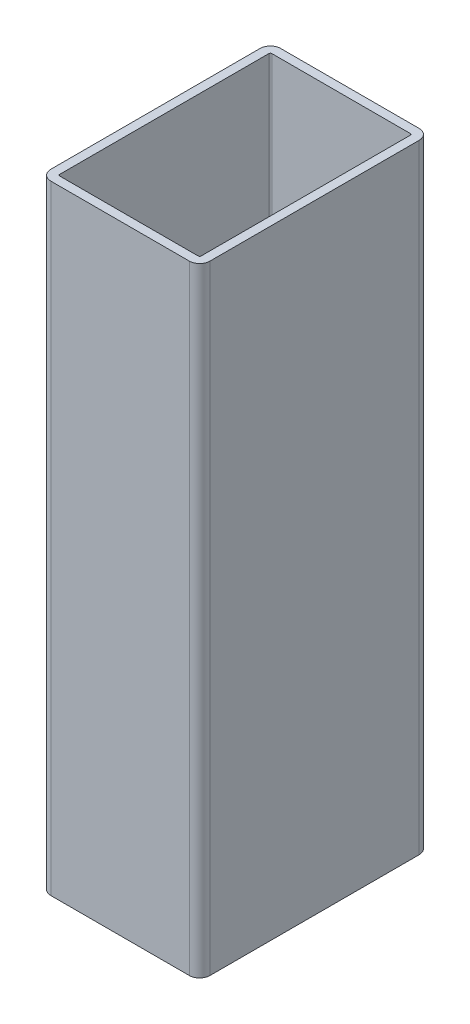
ISO-10303-21;
HEADER;
FILE_DESCRIPTION(('STEP AP214'),'2;1');
FILE_NAME('part.step','',(''),(''),'','','');
FILE_SCHEMA(('AUTOMOTIVE_DESIGN { 1 0 10303 214 1 1 1 1 }'));
ENDSEC;
DATA;
#1=APPLICATION_CONTEXT('core data for automotive mechanical design processes');
#2=APPLICATION_PROTOCOL_DEFINITION('international standard','automotive_design',2000,#1);
#3=PRODUCT_CONTEXT('',#1,'mechanical');
#4=PRODUCT('Part','Part','',(#3));
#5=PRODUCT_RELATED_PRODUCT_CATEGORY('part','',(#4));
#6=PRODUCT_DEFINITION_FORMATION('','',#4);
#7=PRODUCT_DEFINITION_CONTEXT('part definition',#1,'design');
#8=PRODUCT_DEFINITION('design','',#6,#7);
#9=PRODUCT_DEFINITION_SHAPE('','',#8);
#10=(LENGTH_UNIT() NAMED_UNIT(*) SI_UNIT(.MILLI.,.METRE.));
#11=(NAMED_UNIT(*) PLANE_ANGLE_UNIT() SI_UNIT($,.RADIAN.));
#12=(NAMED_UNIT(*) SI_UNIT($,.STERADIAN.) SOLID_ANGLE_UNIT());
#13=UNCERTAINTY_MEASURE_WITH_UNIT(LENGTH_MEASURE(1.E-05),#10,'distance_accuracy_value','');
#14=(GEOMETRIC_REPRESENTATION_CONTEXT(3) GLOBAL_UNCERTAINTY_ASSIGNED_CONTEXT((#13)) GLOBAL_UNIT_ASSIGNED_CONTEXT((#10,
#11,#12)) REPRESENTATION_CONTEXT('',''));
#15=CARTESIAN_POINT('',(0.,0.,0.));
#16=DIRECTION('',(0.,0.,1.));
#17=DIRECTION('',(1.,0.,0.));
#18=AXIS2_PLACEMENT_3D('',#15,#16,#17);
#19=CARTESIAN_POINT('',(-78.3333333333334,700.,118.333333333333));
#20=DIRECTION('',(0.,-1.,0.));
#21=DIRECTION('',(0.,0.,-1.));
#22=AXIS2_PLACEMENT_3D('',#19,#20,#21);
#23=CYLINDRICAL_SURFACE('',#22,11.6666666666667);
#24=CARTESIAN_POINT('',(-78.3333333333334,0.,118.333333333333));
#25=DIRECTION('',(0.,1.,0.));
#26=DIRECTION('',(0.,0.,1.));
#27=AXIS2_PLACEMENT_3D('',#24,#25,#26);
#28=CIRCLE('',#27,11.6666666666667);
#29=CARTESIAN_POINT('',(-90.0000000000001,0.,118.333333333333));
#30=VERTEX_POINT('',#29);
#31=CARTESIAN_POINT('',(-78.3333333333334,0.,130.));
#32=VERTEX_POINT('',#31);
#33=EDGE_CURVE('E236',#30,#32,#28,.T.);
#34=ORIENTED_EDGE('',*,*,#33,.T.);
#35=DIRECTION('',(0.,-1.,0.));
#36=VECTOR('',#35,1.);
#37=CARTESIAN_POINT('',(-78.3333333333334,700.,130.));
#38=LINE('',#37,#36);
#39=CARTESIAN_POINT('',(-78.3333333333334,700.,130.));
#40=VERTEX_POINT('',#39);
#41=EDGE_CURVE('E12',#40,#32,#38,.T.);
#42=ORIENTED_EDGE('',*,*,#41,.F.);
#43=CARTESIAN_POINT('',(-78.3333333333334,700.,118.333333333333));
#44=DIRECTION('',(0.,1.,0.));
#45=DIRECTION('',(0.,0.,1.));
#46=AXIS2_PLACEMENT_3D('',#43,#44,#45);
#47=CIRCLE('',#46,11.6666666666667);
#48=CARTESIAN_POINT('',(-90.0000000000001,700.,118.333333333333));
#49=VERTEX_POINT('',#48);
#50=EDGE_CURVE('E314',#49,#40,#47,.T.);
#51=ORIENTED_EDGE('',*,*,#50,.F.);
#52=DIRECTION('',(0.,-1.,0.));
#53=VECTOR('',#52,1.);
#54=CARTESIAN_POINT('',(-90.0000000000001,700.,118.333333333333));
#55=LINE('',#54,#53);
#56=EDGE_CURVE('E251',#49,#30,#55,.T.);
#57=ORIENTED_EDGE('',*,*,#56,.T.);
#58=EDGE_LOOP('',(#34,#42,#51,#57));
#59=FACE_BOUND('',#58,.T.);
#60=ADVANCED_FACE('F64',(#59),#23,.T.);
#61=CARTESIAN_POINT('',(-78.3333333333334,700.,130.));
#62=DIRECTION('',(0.,0.,-1.));
#63=DIRECTION('',(-1.,0.,0.));
#64=AXIS2_PLACEMENT_3D('',#61,#62,#63);
#65=PLANE('',#64);
#66=DIRECTION('',(1.,0.,0.));
#67=VECTOR('',#66,1.);
#68=CARTESIAN_POINT('',(-78.3333333333334,0.,130.));
#69=LINE('',#68,#67);
#70=CARTESIAN_POINT('',(78.3333333333334,0.,130.));
#71=VERTEX_POINT('',#70);
#72=EDGE_CURVE('E239',#32,#71,#69,.T.);
#73=ORIENTED_EDGE('',*,*,#72,.T.);
#74=DIRECTION('',(0.,-1.,0.));
#75=VECTOR('',#74,1.);
#76=CARTESIAN_POINT('',(78.3333333333334,700.,130.));
#77=LINE('',#76,#75);
#78=CARTESIAN_POINT('',(78.3333333333334,700.,130.));
#79=VERTEX_POINT('',#78);
#80=EDGE_CURVE('E74',#79,#71,#77,.T.);
#81=ORIENTED_EDGE('',*,*,#80,.F.);
#82=DIRECTION('',(1.,0.,0.));
#83=VECTOR('',#82,1.);
#84=CARTESIAN_POINT('',(-78.3333333333334,700.,130.));
#85=LINE('',#84,#83);
#86=EDGE_CURVE('E316',#40,#79,#85,.T.);
#87=ORIENTED_EDGE('',*,*,#86,.F.);
#88=ORIENTED_EDGE('',*,*,#41,.T.);
#89=EDGE_LOOP('',(#73,#81,#87,#88));
#90=FACE_BOUND('',#89,.T.);
#91=ADVANCED_FACE('F351',(#90),#65,.F.);
#92=CARTESIAN_POINT('',(78.3333333333334,700.,118.333333333333));
#93=DIRECTION('',(0.,-1.,0.));
#94=DIRECTION('',(0.,0.,-1.));
#95=AXIS2_PLACEMENT_3D('',#92,#93,#94);
#96=CYLINDRICAL_SURFACE('',#95,11.6666666666667);
#97=CARTESIAN_POINT('',(78.3333333333334,0.,118.333333333333));
#98=DIRECTION('',(0.,1.,0.));
#99=DIRECTION('',(0.,0.,1.));
#100=AXIS2_PLACEMENT_3D('',#97,#98,#99);
#101=CIRCLE('',#100,11.6666666666667);
#102=CARTESIAN_POINT('',(90.0000000000001,0.,118.333333333333));
#103=VERTEX_POINT('',#102);
#104=EDGE_CURVE('E241',#71,#103,#101,.T.);
#105=ORIENTED_EDGE('',*,*,#104,.T.);
#106=DIRECTION('',(0.,-1.,0.));
#107=VECTOR('',#106,1.);
#108=CARTESIAN_POINT('',(90.0000000000001,700.,118.333333333333));
#109=LINE('',#108,#107);
#110=CARTESIAN_POINT('',(90.0000000000001,700.,118.333333333333));
#111=VERTEX_POINT('',#110);
#112=EDGE_CURVE('E258',#111,#103,#109,.T.);
#113=ORIENTED_EDGE('',*,*,#112,.F.);
#114=CARTESIAN_POINT('',(78.3333333333334,700.,118.333333333333));
#115=DIRECTION('',(0.,1.,0.));
#116=DIRECTION('',(0.,0.,1.));
#117=AXIS2_PLACEMENT_3D('',#114,#115,#116);
#118=CIRCLE('',#117,11.6666666666667);
#119=EDGE_CURVE('E318',#79,#111,#118,.T.);
#120=ORIENTED_EDGE('',*,*,#119,.F.);
#121=ORIENTED_EDGE('',*,*,#80,.T.);
#122=EDGE_LOOP('',(#105,#113,#120,#121));
#123=FACE_BOUND('',#122,.T.);
#124=ADVANCED_FACE('F356',(#123),#96,.T.);
#125=CARTESIAN_POINT('',(90.,700.,-118.333333333333));
#126=DIRECTION('',(-1.,0.,0.));
#127=DIRECTION('',(0.,0.,1.));
#128=AXIS2_PLACEMENT_3D('',#125,#126,#127);
#129=PLANE('',#128);
#130=DIRECTION('',(0.,0.,-1.));
#131=VECTOR('',#130,1.);
#132=CARTESIAN_POINT('',(90.,0.,-118.333333333333));
#133=LINE('',#132,#131);
#134=CARTESIAN_POINT('',(90.0000000000001,0.,-118.333333333333));
#135=VERTEX_POINT('',#134);
#136=EDGE_CURVE('E243',#103,#135,#133,.T.);
#137=ORIENTED_EDGE('',*,*,#136,.T.);
#138=DIRECTION('',(0.,-1.,0.));
#139=VECTOR('',#138,1.);
#140=CARTESIAN_POINT('',(90.0000000000001,700.,-118.333333333333));
#141=LINE('',#140,#139);
#142=CARTESIAN_POINT('',(90.0000000000001,700.,-118.333333333333));
#143=VERTEX_POINT('',#142);
#144=EDGE_CURVE('E255',#143,#135,#141,.T.);
#145=ORIENTED_EDGE('',*,*,#144,.F.);
#146=DIRECTION('',(0.,0.,-1.));
#147=VECTOR('',#146,1.);
#148=CARTESIAN_POINT('',(90.,700.,-118.333333333333));
#149=LINE('',#148,#147);
#150=EDGE_CURVE('E320',#111,#143,#149,.T.);
#151=ORIENTED_EDGE('',*,*,#150,.F.);
#152=ORIENTED_EDGE('',*,*,#112,.T.);
#153=EDGE_LOOP('',(#137,#145,#151,#152));
#154=FACE_BOUND('',#153,.T.);
#155=ADVANCED_FACE('F326',(#154),#129,.F.);
#156=CARTESIAN_POINT('',(78.3333333333334,700.,-118.333333333333));
#157=DIRECTION('',(0.,-1.,0.));
#158=DIRECTION('',(0.,0.,-1.));
#159=AXIS2_PLACEMENT_3D('',#156,#157,#158);
#160=CYLINDRICAL_SURFACE('',#159,11.6666666666667);
#161=CARTESIAN_POINT('',(78.3333333333334,0.,-118.333333333333));
#162=DIRECTION('',(0.,1.,0.));
#163=DIRECTION('',(0.,0.,1.));
#164=AXIS2_PLACEMENT_3D('',#161,#162,#163);
#165=CIRCLE('',#164,11.6666666666667);
#166=CARTESIAN_POINT('',(78.3333333333334,0.,-130.));
#167=VERTEX_POINT('',#166);
#168=EDGE_CURVE('E245',#135,#167,#165,.T.);
#169=ORIENTED_EDGE('',*,*,#168,.T.);
#170=DIRECTION('',(0.,-1.,0.));
#171=VECTOR('',#170,1.);
#172=CARTESIAN_POINT('',(78.3333333333334,700.,-130.));
#173=LINE('',#172,#171);
#174=CARTESIAN_POINT('',(78.3333333333334,700.,-130.));
#175=VERTEX_POINT('',#174);
#176=EDGE_CURVE('E203',#175,#167,#173,.T.);
#177=ORIENTED_EDGE('',*,*,#176,.F.);
#178=CARTESIAN_POINT('',(78.3333333333334,700.,-118.333333333333));
#179=DIRECTION('',(0.,1.,0.));
#180=DIRECTION('',(0.,0.,1.));
#181=AXIS2_PLACEMENT_3D('',#178,#179,#180);
#182=CIRCLE('',#181,11.6666666666667);
#183=EDGE_CURVE('E194',#143,#175,#182,.T.);
#184=ORIENTED_EDGE('',*,*,#183,.F.);
#185=ORIENTED_EDGE('',*,*,#144,.T.);
#186=EDGE_LOOP('',(#169,#177,#184,#185));
#187=FACE_BOUND('',#186,.T.);
#188=ADVANCED_FACE('F330',(#187),#160,.T.);
#189=CARTESIAN_POINT('',(78.3333333333334,700.,-130.));
#190=DIRECTION('',(0.,0.,1.));
#191=DIRECTION('',(1.,0.,0.));
#192=AXIS2_PLACEMENT_3D('',#189,#190,#191);
#193=PLANE('',#192);
#194=DIRECTION('',(-1.,0.,0.));
#195=VECTOR('',#194,1.);
#196=CARTESIAN_POINT('',(78.3333333333334,0.,-130.));
#197=LINE('',#196,#195);
#198=CARTESIAN_POINT('',(-78.3333333333334,0.,-130.));
#199=VERTEX_POINT('',#198);
#200=EDGE_CURVE('E202',#167,#199,#197,.T.);
#201=ORIENTED_EDGE('',*,*,#200,.T.);
#202=DIRECTION('',(0.,-1.,0.));
#203=VECTOR('',#202,1.);
#204=CARTESIAN_POINT('',(-78.3333333333334,700.,-130.));
#205=LINE('',#204,#203);
#206=CARTESIAN_POINT('',(-78.3333333333334,700.,-130.));
#207=VERTEX_POINT('',#206);
#208=EDGE_CURVE('E199',#207,#199,#205,.T.);
#209=ORIENTED_EDGE('',*,*,#208,.F.);
#210=DIRECTION('',(-1.,0.,0.));
#211=VECTOR('',#210,1.);
#212=CARTESIAN_POINT('',(78.3333333333334,700.,-130.));
#213=LINE('',#212,#211);
#214=EDGE_CURVE('E188',#175,#207,#213,.T.);
#215=ORIENTED_EDGE('',*,*,#214,.F.);
#216=ORIENTED_EDGE('',*,*,#176,.T.);
#217=EDGE_LOOP('',(#201,#209,#215,#216));
#218=FACE_BOUND('',#217,.T.);
#219=ADVANCED_FACE('F200',(#218),#193,.F.);
#220=CARTESIAN_POINT('',(-78.3333333333334,700.,-118.333333333333));
#221=DIRECTION('',(0.,-1.,0.));
#222=DIRECTION('',(0.,0.,-1.));
#223=AXIS2_PLACEMENT_3D('',#220,#221,#222);
#224=CYLINDRICAL_SURFACE('',#223,11.6666666666667);
#225=CARTESIAN_POINT('',(-78.3333333333334,0.,-118.333333333333));
#226=DIRECTION('',(0.,1.,0.));
#227=DIRECTION('',(0.,0.,1.));
#228=AXIS2_PLACEMENT_3D('',#225,#226,#227);
#229=CIRCLE('',#228,11.6666666666667);
#230=CARTESIAN_POINT('',(-90.0000000000001,0.,-118.333333333333));
#231=VERTEX_POINT('',#230);
#232=EDGE_CURVE('E136',#199,#231,#229,.T.);
#233=ORIENTED_EDGE('',*,*,#232,.T.);
#234=DIRECTION('',(0.,-1.,0.));
#235=VECTOR('',#234,1.);
#236=CARTESIAN_POINT('',(-90.0000000000001,700.,-118.333333333333));
#237=LINE('',#236,#235);
#238=CARTESIAN_POINT('',(-90.0000000000001,700.,-118.333333333333));
#239=VERTEX_POINT('',#238);
#240=EDGE_CURVE('E204',#239,#231,#237,.T.);
#241=ORIENTED_EDGE('',*,*,#240,.F.);
#242=CARTESIAN_POINT('',(-78.3333333333334,700.,-118.333333333333));
#243=DIRECTION('',(0.,1.,0.));
#244=DIRECTION('',(0.,0.,1.));
#245=AXIS2_PLACEMENT_3D('',#242,#243,#244);
#246=CIRCLE('',#245,11.6666666666667);
#247=EDGE_CURVE('E192',#207,#239,#246,.T.);
#248=ORIENTED_EDGE('',*,*,#247,.F.);
#249=ORIENTED_EDGE('',*,*,#208,.T.);
#250=EDGE_LOOP('',(#233,#241,#248,#249));
#251=FACE_BOUND('',#250,.T.);
#252=ADVANCED_FACE('F206',(#251),#224,.T.);
#253=CARTESIAN_POINT('',(78.3333333333334,700.,118.333333333333));
#254=DIRECTION('',(0.,-1.,0.));
#255=DIRECTION('',(0.,0.,-1.));
#256=AXIS2_PLACEMENT_3D('',#253,#254,#255);
#257=CYLINDRICAL_SURFACE('',#256,1.66666666666669);
#258=CARTESIAN_POINT('',(78.3333333333334,0.,118.333333333333));
#259=DIRECTION('',(0.,1.,0.));
#260=DIRECTION('',(0.,0.,1.));
#261=AXIS2_PLACEMENT_3D('',#258,#259,#260);
#262=CIRCLE('',#261,1.66666666666669);
#263=CARTESIAN_POINT('',(78.3333333333334,0.,120.));
#264=VERTEX_POINT('',#263);
#265=CARTESIAN_POINT('',(80.0000000000001,0.,118.333333333333));
#266=VERTEX_POINT('',#265);
#267=EDGE_CURVE('E212',#264,#266,#262,.T.);
#268=ORIENTED_EDGE('',*,*,#267,.F.);
#269=DIRECTION('',(0.,-1.,0.));
#270=VECTOR('',#269,1.);
#271=CARTESIAN_POINT('',(78.3333333333334,700.,120.));
#272=LINE('',#271,#270);
#273=CARTESIAN_POINT('',(78.3333333333334,700.,120.));
#274=VERTEX_POINT('',#273);
#275=EDGE_CURVE('E68',#274,#264,#272,.T.);
#276=ORIENTED_EDGE('',*,*,#275,.F.);
#277=CARTESIAN_POINT('',(78.3333333333334,700.,118.333333333333));
#278=DIRECTION('',(0.,1.,0.));
#279=DIRECTION('',(0.,0.,1.));
#280=AXIS2_PLACEMENT_3D('',#277,#278,#279);
#281=CIRCLE('',#280,1.66666666666669);
#282=CARTESIAN_POINT('',(80.0000000000001,700.,118.333333333333));
#283=VERTEX_POINT('',#282);
#284=EDGE_CURVE('E250',#274,#283,#281,.T.);
#285=ORIENTED_EDGE('',*,*,#284,.T.);
#286=DIRECTION('',(0.,-1.,0.));
#287=VECTOR('',#286,1.);
#288=CARTESIAN_POINT('',(80.0000000000001,700.,118.333333333333));
#289=LINE('',#288,#287);
#290=EDGE_CURVE('E208',#283,#266,#289,.T.);
#291=ORIENTED_EDGE('',*,*,#290,.T.);
#292=EDGE_LOOP('',(#268,#276,#285,#291));
#293=FACE_BOUND('',#292,.T.);
#294=ADVANCED_FACE('F66',(#293),#257,.F.);
#295=CARTESIAN_POINT('',(-78.3333333333334,700.,120.));
#296=DIRECTION('',(0.,0.,-1.));
#297=DIRECTION('',(-1.,0.,0.));
#298=AXIS2_PLACEMENT_3D('',#295,#296,#297);
#299=PLANE('',#298);
#300=DIRECTION('',(1.,0.,0.));
#301=VECTOR('',#300,1.);
#302=CARTESIAN_POINT('',(-78.3333333333334,0.,120.));
#303=LINE('',#302,#301);
#304=CARTESIAN_POINT('',(-78.3333333333334,0.,120.));
#305=VERTEX_POINT('',#304);
#306=EDGE_CURVE('E215',#305,#264,#303,.T.);
#307=ORIENTED_EDGE('',*,*,#306,.F.);
#308=DIRECTION('',(0.,-1.,0.));
#309=VECTOR('',#308,1.);
#310=CARTESIAN_POINT('',(-78.3333333333334,700.,120.));
#311=LINE('',#310,#309);
#312=CARTESIAN_POINT('',(-78.3333333333334,700.,120.));
#313=VERTEX_POINT('',#312);
#314=EDGE_CURVE('E273',#313,#305,#311,.T.);
#315=ORIENTED_EDGE('',*,*,#314,.F.);
#316=DIRECTION('',(1.,0.,0.));
#317=VECTOR('',#316,1.);
#318=CARTESIAN_POINT('',(-78.3333333333334,700.,120.));
#319=LINE('',#318,#317);
#320=EDGE_CURVE('E282',#313,#274,#319,.T.);
#321=ORIENTED_EDGE('',*,*,#320,.T.);
#322=ORIENTED_EDGE('',*,*,#275,.T.);
#323=EDGE_LOOP('',(#307,#315,#321,#322));
#324=FACE_BOUND('',#323,.T.);
#325=ADVANCED_FACE('F280',(#324),#299,.T.);
#326=CARTESIAN_POINT('',(-78.3333333333334,700.,118.333333333333));
#327=DIRECTION('',(0.,-1.,0.));
#328=DIRECTION('',(0.,0.,-1.));
#329=AXIS2_PLACEMENT_3D('',#326,#327,#328);
#330=CYLINDRICAL_SURFACE('',#329,1.66666666666669);
#331=CARTESIAN_POINT('',(-78.3333333333334,0.,118.333333333333));
#332=DIRECTION('',(0.,1.,0.));
#333=DIRECTION('',(0.,0.,1.));
#334=AXIS2_PLACEMENT_3D('',#331,#332,#333);
#335=CIRCLE('',#334,1.66666666666669);
#336=CARTESIAN_POINT('',(-80.0000000000001,0.,118.333333333333));
#337=VERTEX_POINT('',#336);
#338=EDGE_CURVE('E218',#337,#305,#335,.T.);
#339=ORIENTED_EDGE('',*,*,#338,.F.);
#340=DIRECTION('',(0.,-1.,0.));
#341=VECTOR('',#340,1.);
#342=CARTESIAN_POINT('',(-80.0000000000001,700.,118.333333333333));
#343=LINE('',#342,#341);
#344=CARTESIAN_POINT('',(-80.0000000000001,700.,118.333333333333));
#345=VERTEX_POINT('',#344);
#346=EDGE_CURVE('E272',#345,#337,#343,.T.);
#347=ORIENTED_EDGE('',*,*,#346,.F.);
#348=CARTESIAN_POINT('',(-78.3333333333334,700.,118.333333333333));
#349=DIRECTION('',(0.,1.,0.));
#350=DIRECTION('',(0.,0.,1.));
#351=AXIS2_PLACEMENT_3D('',#348,#349,#350);
#352=CIRCLE('',#351,1.66666666666669);
#353=EDGE_CURVE('E290',#345,#313,#352,.T.);
#354=ORIENTED_EDGE('',*,*,#353,.T.);
#355=ORIENTED_EDGE('',*,*,#314,.T.);
#356=EDGE_LOOP('',(#339,#347,#354,#355));
#357=FACE_BOUND('',#356,.T.);
#358=ADVANCED_FACE('F288',(#357),#330,.F.);
#359=CARTESIAN_POINT('',(-80.0000000000001,700.,118.333333333333));
#360=DIRECTION('',(1.,0.,0.));
#361=DIRECTION('',(0.,0.,-1.));
#362=AXIS2_PLACEMENT_3D('',#359,#360,#361);
#363=PLANE('',#362);
#364=DIRECTION('',(0.,0.,1.));
#365=VECTOR('',#364,1.);
#366=CARTESIAN_POINT('',(-80.0000000000001,0.,118.333333333333));
#367=LINE('',#366,#365);
#368=CARTESIAN_POINT('',(-80.0000000000001,0.,-118.333333333333));
#369=VERTEX_POINT('',#368);
#370=EDGE_CURVE('E221',#369,#337,#367,.T.);
#371=ORIENTED_EDGE('',*,*,#370,.F.);
#372=DIRECTION('',(0.,-1.,0.));
#373=VECTOR('',#372,1.);
#374=CARTESIAN_POINT('',(-80.0000000000001,700.,-118.333333333333));
#375=LINE('',#374,#373);
#376=CARTESIAN_POINT('',(-80.0000000000001,700.,-118.333333333333));
#377=VERTEX_POINT('',#376);
#378=EDGE_CURVE('E270',#377,#369,#375,.T.);
#379=ORIENTED_EDGE('',*,*,#378,.F.);
#380=DIRECTION('',(0.,0.,1.));
#381=VECTOR('',#380,1.);
#382=CARTESIAN_POINT('',(-80.0000000000001,700.,118.333333333333));
#383=LINE('',#382,#381);
#384=EDGE_CURVE('E296',#377,#345,#383,.T.);
#385=ORIENTED_EDGE('',*,*,#384,.T.);
#386=ORIENTED_EDGE('',*,*,#346,.T.);
#387=EDGE_LOOP('',(#371,#379,#385,#386));
#388=FACE_BOUND('',#387,.T.);
#389=ADVANCED_FACE('F299',(#388),#363,.T.);
#390=CARTESIAN_POINT('',(-78.3333333333334,700.,-118.333333333333));
#391=DIRECTION('',(0.,-1.,0.));
#392=DIRECTION('',(0.,0.,-1.));
#393=AXIS2_PLACEMENT_3D('',#390,#391,#392);
#394=CYLINDRICAL_SURFACE('',#393,1.66666666666669);
#395=CARTESIAN_POINT('',(-78.3333333333334,0.,-118.333333333333));
#396=DIRECTION('',(0.,1.,0.));
#397=DIRECTION('',(0.,0.,1.));
#398=AXIS2_PLACEMENT_3D('',#395,#396,#397);
#399=CIRCLE('',#398,1.66666666666669);
#400=CARTESIAN_POINT('',(-78.3333333333334,0.,-120.));
#401=VERTEX_POINT('',#400);
#402=EDGE_CURVE('E224',#401,#369,#399,.T.);
#403=ORIENTED_EDGE('',*,*,#402,.F.);
#404=DIRECTION('',(0.,-1.,0.));
#405=VECTOR('',#404,1.);
#406=CARTESIAN_POINT('',(-78.3333333333334,700.,-120.));
#407=LINE('',#406,#405);
#408=CARTESIAN_POINT('',(-78.3333333333334,700.,-120.));
#409=VERTEX_POINT('',#408);
#410=EDGE_CURVE('E268',#409,#401,#407,.T.);
#411=ORIENTED_EDGE('',*,*,#410,.F.);
#412=CARTESIAN_POINT('',(-78.3333333333334,700.,-118.333333333333));
#413=DIRECTION('',(0.,1.,0.));
#414=DIRECTION('',(0.,0.,1.));
#415=AXIS2_PLACEMENT_3D('',#412,#413,#414);
#416=CIRCLE('',#415,1.66666666666669);
#417=EDGE_CURVE('E300',#409,#377,#416,.T.);
#418=ORIENTED_EDGE('',*,*,#417,.T.);
#419=ORIENTED_EDGE('',*,*,#378,.T.);
#420=EDGE_LOOP('',(#403,#411,#418,#419));
#421=FACE_BOUND('',#420,.T.);
#422=ADVANCED_FACE('F367',(#421),#394,.F.);
#423=CARTESIAN_POINT('',(78.3333333333334,700.,-120.));
#424=DIRECTION('',(0.,0.,1.));
#425=DIRECTION('',(1.,0.,0.));
#426=AXIS2_PLACEMENT_3D('',#423,#424,#425);
#427=PLANE('',#426);
#428=DIRECTION('',(-1.,0.,0.));
#429=VECTOR('',#428,1.);
#430=CARTESIAN_POINT('',(78.3333333333334,0.,-120.));
#431=LINE('',#430,#429);
#432=CARTESIAN_POINT('',(78.3333333333334,0.,-120.));
#433=VERTEX_POINT('',#432);
#434=EDGE_CURVE('E227',#433,#401,#431,.T.);
#435=ORIENTED_EDGE('',*,*,#434,.F.);
#436=DIRECTION('',(0.,-1.,0.));
#437=VECTOR('',#436,1.);
#438=CARTESIAN_POINT('',(78.3333333333334,700.,-120.));
#439=LINE('',#438,#437);
#440=CARTESIAN_POINT('',(78.3333333333334,700.,-120.));
#441=VERTEX_POINT('',#440);
#442=EDGE_CURVE('E266',#441,#433,#439,.T.);
#443=ORIENTED_EDGE('',*,*,#442,.F.);
#444=DIRECTION('',(-1.,0.,0.));
#445=VECTOR('',#444,1.);
#446=CARTESIAN_POINT('',(78.3333333333334,700.,-120.));
#447=LINE('',#446,#445);
#448=EDGE_CURVE('E302',#441,#409,#447,.T.);
#449=ORIENTED_EDGE('',*,*,#448,.T.);
#450=ORIENTED_EDGE('',*,*,#410,.T.);
#451=EDGE_LOOP('',(#435,#443,#449,#450));
#452=FACE_BOUND('',#451,.T.);
#453=ADVANCED_FACE('F363',(#452),#427,.T.);
#454=CARTESIAN_POINT('',(78.3333333333334,700.,-118.333333333333));
#455=DIRECTION('',(0.,-1.,0.));
#456=DIRECTION('',(0.,0.,-1.));
#457=AXIS2_PLACEMENT_3D('',#454,#455,#456);
#458=CYLINDRICAL_SURFACE('',#457,1.66666666666668);
#459=CARTESIAN_POINT('',(78.3333333333334,0.,-118.333333333333));
#460=DIRECTION('',(0.,1.,0.));
#461=DIRECTION('',(0.,0.,1.));
#462=AXIS2_PLACEMENT_3D('',#459,#460,#461);
#463=CIRCLE('',#462,1.66666666666668);
#464=CARTESIAN_POINT('',(80.0000000000001,0.,-118.333333333333));
#465=VERTEX_POINT('',#464);
#466=EDGE_CURVE('E230',#465,#433,#463,.T.);
#467=ORIENTED_EDGE('',*,*,#466,.F.);
#468=DIRECTION('',(0.,-1.,0.));
#469=VECTOR('',#468,1.);
#470=CARTESIAN_POINT('',(80.0000000000001,700.,-118.333333333333));
#471=LINE('',#470,#469);
#472=CARTESIAN_POINT('',(80.0000000000001,700.,-118.333333333333));
#473=VERTEX_POINT('',#472);
#474=EDGE_CURVE('E264',#473,#465,#471,.T.);
#475=ORIENTED_EDGE('',*,*,#474,.F.);
#476=CARTESIAN_POINT('',(78.3333333333334,700.,-118.333333333333));
#477=DIRECTION('',(0.,1.,0.));
#478=DIRECTION('',(0.,0.,1.));
#479=AXIS2_PLACEMENT_3D('',#476,#477,#478);
#480=CIRCLE('',#479,1.66666666666668);
#481=EDGE_CURVE('E308',#473,#441,#480,.T.);
#482=ORIENTED_EDGE('',*,*,#481,.T.);
#483=ORIENTED_EDGE('',*,*,#442,.T.);
#484=EDGE_LOOP('',(#467,#475,#482,#483));
#485=FACE_BOUND('',#484,.T.);
#486=ADVANCED_FACE('F345',(#485),#458,.F.);
#487=CARTESIAN_POINT('',(80.0000000000001,700.,-118.333333333333));
#488=DIRECTION('',(-1.,0.,0.));
#489=DIRECTION('',(0.,0.,1.));
#490=AXIS2_PLACEMENT_3D('',#487,#488,#489);
#491=PLANE('',#490);
#492=DIRECTION('',(0.,0.,-1.));
#493=VECTOR('',#492,1.);
#494=CARTESIAN_POINT('',(80.0000000000001,0.,-118.333333333333));
#495=LINE('',#494,#493);
#496=EDGE_CURVE('E233',#266,#465,#495,.T.);
#497=ORIENTED_EDGE('',*,*,#496,.F.);
#498=ORIENTED_EDGE('',*,*,#290,.F.);
#499=DIRECTION('',(0.,0.,-1.));
#500=VECTOR('',#499,1.);
#501=CARTESIAN_POINT('',(80.0000000000001,700.,-118.333333333333));
#502=LINE('',#501,#500);
#503=EDGE_CURVE('E311',#283,#473,#502,.T.);
#504=ORIENTED_EDGE('',*,*,#503,.T.);
#505=ORIENTED_EDGE('',*,*,#474,.T.);
#506=EDGE_LOOP('',(#497,#498,#504,#505));
#507=FACE_BOUND('',#506,.T.);
#508=ADVANCED_FACE('F338',(#507),#491,.T.);
#509=CARTESIAN_POINT('',(-90.0000000000001,700.,118.333333333333));
#510=DIRECTION('',(1.,0.,0.));
#511=DIRECTION('',(0.,0.,-1.));
#512=AXIS2_PLACEMENT_3D('',#509,#510,#511);
#513=PLANE('',#512);
#514=DIRECTION('',(0.,0.,1.));
#515=VECTOR('',#514,1.);
#516=CARTESIAN_POINT('',(-90.0000000000001,0.,118.333333333333));
#517=LINE('',#516,#515);
#518=EDGE_CURVE('E142',#231,#30,#517,.T.);
#519=ORIENTED_EDGE('',*,*,#518,.T.);
#520=ORIENTED_EDGE('',*,*,#56,.F.);
#521=DIRECTION('',(0.,0.,1.));
#522=VECTOR('',#521,1.);
#523=CARTESIAN_POINT('',(-90.0000000000001,700.,118.333333333333));
#524=LINE('',#523,#522);
#525=EDGE_CURVE('E83',#239,#49,#524,.T.);
#526=ORIENTED_EDGE('',*,*,#525,.F.);
#527=ORIENTED_EDGE('',*,*,#240,.T.);
#528=EDGE_LOOP('',(#519,#520,#526,#527));
#529=FACE_BOUND('',#528,.T.);
#530=ADVANCED_FACE('F336',(#529),#513,.F.);
#531=CARTESIAN_POINT('',(-78.3333333333334,700.,118.333333333333));
#532=DIRECTION('',(0.,1.,0.));
#533=DIRECTION('',(0.,0.,1.));
#534=AXIS2_PLACEMENT_3D('',#531,#532,#533);
#535=PLANE('',#534);
#536=ORIENTED_EDGE('',*,*,#284,.F.);
#537=ORIENTED_EDGE('',*,*,#320,.F.);
#538=ORIENTED_EDGE('',*,*,#353,.F.);
#539=ORIENTED_EDGE('',*,*,#384,.F.);
#540=ORIENTED_EDGE('',*,*,#417,.F.);
#541=ORIENTED_EDGE('',*,*,#448,.F.);
#542=ORIENTED_EDGE('',*,*,#481,.F.);
#543=ORIENTED_EDGE('',*,*,#503,.F.);
#544=EDGE_LOOP('',(#536,#537,#538,#539,#540,#541,#542,#543));
#545=FACE_BOUND('',#544,.T.);
#546=ORIENTED_EDGE('',*,*,#50,.T.);
#547=ORIENTED_EDGE('',*,*,#86,.T.);
#548=ORIENTED_EDGE('',*,*,#119,.T.);
#549=ORIENTED_EDGE('',*,*,#150,.T.);
#550=ORIENTED_EDGE('',*,*,#183,.T.);
#551=ORIENTED_EDGE('',*,*,#214,.T.);
#552=ORIENTED_EDGE('',*,*,#247,.T.);
#553=ORIENTED_EDGE('',*,*,#525,.T.);
#554=EDGE_LOOP('',(#546,#547,#548,#549,#550,#551,#552,#553));
#555=FACE_BOUND('',#554,.T.);
#556=ADVANCED_FACE('F190',(#545,#555),#535,.T.);
#557=CARTESIAN_POINT('',(-78.3333333333334,0.,118.333333333333));
#558=DIRECTION('',(0.,1.,0.));
#559=DIRECTION('',(0.,0.,1.));
#560=AXIS2_PLACEMENT_3D('',#557,#558,#559);
#561=PLANE('',#560);
#562=ORIENTED_EDGE('',*,*,#267,.T.);
#563=ORIENTED_EDGE('',*,*,#496,.T.);
#564=ORIENTED_EDGE('',*,*,#466,.T.);
#565=ORIENTED_EDGE('',*,*,#434,.T.);
#566=ORIENTED_EDGE('',*,*,#402,.T.);
#567=ORIENTED_EDGE('',*,*,#370,.T.);
#568=ORIENTED_EDGE('',*,*,#338,.T.);
#569=ORIENTED_EDGE('',*,*,#306,.T.);
#570=EDGE_LOOP('',(#562,#563,#564,#565,#566,#567,#568,#569));
#571=FACE_BOUND('',#570,.T.);
#572=ORIENTED_EDGE('',*,*,#33,.F.);
#573=ORIENTED_EDGE('',*,*,#518,.F.);
#574=ORIENTED_EDGE('',*,*,#232,.F.);
#575=ORIENTED_EDGE('',*,*,#200,.F.);
#576=ORIENTED_EDGE('',*,*,#168,.F.);
#577=ORIENTED_EDGE('',*,*,#136,.F.);
#578=ORIENTED_EDGE('',*,*,#104,.F.);
#579=ORIENTED_EDGE('',*,*,#72,.F.);
#580=EDGE_LOOP('',(#572,#573,#574,#575,#576,#577,#578,#579));
#581=FACE_BOUND('',#580,.T.);
#582=ADVANCED_FACE('F285',(#571,#581),#561,.F.);
#583=CLOSED_SHELL('',(#60,#91,#124,#155,#188,#219,#252,#294,#325,#358,#389,#422,#453,#486,#508,
#530,#556,#582));
#584=MANIFOLD_SOLID_BREP('B2',#583);
#585=ADVANCED_BREP_SHAPE_REPRESENTATION('',(#18,#584),#14);
#586=SHAPE_DEFINITION_REPRESENTATION(#9,#585);
ENDSEC;
END-ISO-10303-21;
